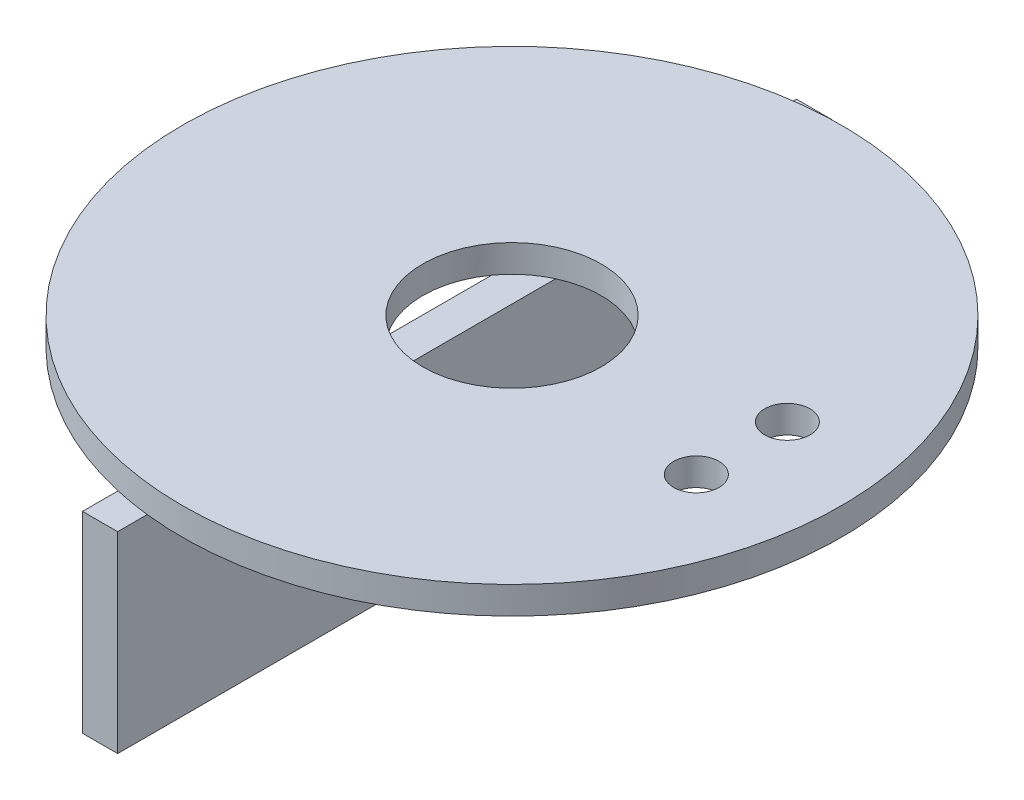
ISO-10303-21;
HEADER;
FILE_DESCRIPTION(('STEP AP214'),'2;1');
FILE_NAME('part.step','',(''),(''),'','','');
FILE_SCHEMA(('AUTOMOTIVE_DESIGN { 1 0 10303 214 1 1 1 1 }'));
ENDSEC;
DATA;
#1=APPLICATION_CONTEXT('core data for automotive mechanical design processes');
#2=APPLICATION_PROTOCOL_DEFINITION('international standard','automotive_design',2000,#1);
#3=PRODUCT_CONTEXT('',#1,'mechanical');
#4=PRODUCT('Part','Part','',(#3));
#5=PRODUCT_RELATED_PRODUCT_CATEGORY('part','',(#4));
#6=PRODUCT_DEFINITION_FORMATION('','',#4);
#7=PRODUCT_DEFINITION_CONTEXT('part definition',#1,'design');
#8=PRODUCT_DEFINITION('design','',#6,#7);
#9=PRODUCT_DEFINITION_SHAPE('','',#8);
#10=(LENGTH_UNIT() NAMED_UNIT(*) SI_UNIT(.MILLI.,.METRE.));
#11=(NAMED_UNIT(*) PLANE_ANGLE_UNIT() SI_UNIT($,.RADIAN.));
#12=(NAMED_UNIT(*) SI_UNIT($,.STERADIAN.) SOLID_ANGLE_UNIT());
#13=UNCERTAINTY_MEASURE_WITH_UNIT(LENGTH_MEASURE(1.E-05),#10,'distance_accuracy_value','');
#14=(GEOMETRIC_REPRESENTATION_CONTEXT(3) GLOBAL_UNCERTAINTY_ASSIGNED_CONTEXT((#13)) GLOBAL_UNIT_ASSIGNED_CONTEXT((#10,
#11,#12)) REPRESENTATION_CONTEXT('',''));
#15=CARTESIAN_POINT('',(0.,0.,0.));
#16=DIRECTION('',(0.,0.,1.));
#17=DIRECTION('',(1.,0.,0.));
#18=AXIS2_PLACEMENT_3D('',#15,#16,#17);
#19=CARTESIAN_POINT('',(0.,0.,0.));
#20=DIRECTION('',(0.,1.,0.));
#21=DIRECTION('',(0.,0.,1.));
#22=AXIS2_PLACEMENT_3D('',#19,#20,#21);
#23=PLANE('',#22);
#24=CARTESIAN_POINT('',(16.74,0.,3.315));
#25=DIRECTION('',(0.,-1.,0.));
#26=DIRECTION('',(0.,0.,-1.));
#27=AXIS2_PLACEMENT_3D('',#24,#25,#26);
#28=CIRCLE('',#27,1.65);
#29=CARTESIAN_POINT('',(16.74,0.,1.665));
#30=VERTEX_POINT('',#29);
#31=EDGE_CURVE('E152',#30,#30,#28,.T.);
#32=ORIENTED_EDGE('',*,*,#31,.F.);
#33=EDGE_LOOP('',(#32));
#34=FACE_BOUND('',#33,.T.);
#35=CARTESIAN_POINT('',(16.74,0.,-3.315));
#36=DIRECTION('',(0.,-1.,0.));
#37=DIRECTION('',(0.,0.,-1.));
#38=AXIS2_PLACEMENT_3D('',#35,#36,#37);
#39=CIRCLE('',#38,1.65);
#40=CARTESIAN_POINT('',(16.74,0.,-4.965));
#41=VERTEX_POINT('',#40);
#42=EDGE_CURVE('E146',#41,#41,#39,.T.);
#43=ORIENTED_EDGE('',*,*,#42,.F.);
#44=EDGE_LOOP('',(#43));
#45=FACE_BOUND('',#44,.T.);
#46=CARTESIAN_POINT('',(0.,0.,0.));
#47=DIRECTION('',(0.,1.,0.));
#48=DIRECTION('',(0.,0.,1.));
#49=AXIS2_PLACEMENT_3D('',#46,#47,#48);
#50=CIRCLE('',#49,24.);
#51=CARTESIAN_POINT('',(-2.72073101085095,0.,23.8452851265527));
#52=VERTEX_POINT('',#51);
#53=CARTESIAN_POINT('',(-2.72073101085095,0.,-23.8452851265527));
#54=VERTEX_POINT('',#53);
#55=EDGE_CURVE('E166',#52,#54,#50,.T.);
#56=ORIENTED_EDGE('',*,*,#55,.F.);
#57=DIRECTION('',(0.,0.,-1.));
#58=VECTOR('',#57,1.);
#59=CARTESIAN_POINT('',(-2.72073101085095,0.,26.));
#60=LINE('',#59,#58);
#61=CARTESIAN_POINT('',(-2.72073101085095,0.,5.90318750901529));
#62=VERTEX_POINT('',#61);
#63=EDGE_CURVE('E11',#52,#62,#60,.T.);
#64=ORIENTED_EDGE('',*,*,#63,.T.);
#65=CARTESIAN_POINT('',(0.,0.,0.));
#66=DIRECTION('',(0.,1.,0.));
#67=DIRECTION('',(0.,0.,1.));
#68=AXIS2_PLACEMENT_3D('',#65,#66,#67);
#69=CIRCLE('',#68,6.5);
#70=CARTESIAN_POINT('',(-2.72073101085095,0.,-5.90318750901526));
#71=VERTEX_POINT('',#70);
#72=EDGE_CURVE('E160',#62,#71,#69,.T.);
#73=ORIENTED_EDGE('',*,*,#72,.T.);
#74=EDGE_CURVE('E42',#71,#54,#60,.T.);
#75=ORIENTED_EDGE('',*,*,#74,.T.);
#76=EDGE_LOOP('',(#56,#64,#73,#75));
#77=FACE_BOUND('',#76,.T.);
#78=ADVANCED_FACE('F33',(#34,#45,#77),#23,.F.);
#79=CARTESIAN_POINT('',(0.,2.,0.));
#80=DIRECTION('',(0.,-1.,0.));
#81=DIRECTION('',(0.,0.,-1.));
#82=AXIS2_PLACEMENT_3D('',#79,#80,#81);
#83=CYLINDRICAL_SURFACE('',#82,24.);
#84=CARTESIAN_POINT('',(0.,2.,0.));
#85=DIRECTION('',(0.,1.,0.));
#86=DIRECTION('',(0.,0.,1.));
#87=AXIS2_PLACEMENT_3D('',#84,#85,#86);
#88=CIRCLE('',#87,24.);
#89=CARTESIAN_POINT('',(0.,2.,24.));
#90=VERTEX_POINT('',#89);
#91=EDGE_CURVE('E161',#90,#90,#88,.T.);
#92=ORIENTED_EDGE('',*,*,#91,.F.);
#93=EDGE_LOOP('',(#92));
#94=FACE_BOUND('',#93,.T.);
#95=CARTESIAN_POINT('',(-5.27926898914905,0.,-23.4121617741764));
#96=VERTEX_POINT('',#95);
#97=EDGE_CURVE('E163',#54,#96,#50,.T.);
#98=ORIENTED_EDGE('',*,*,#97,.T.);
#99=CARTESIAN_POINT('',(-5.27926898914905,0.,23.4121617741765));
#100=VERTEX_POINT('',#99);
#101=EDGE_CURVE('E165',#96,#100,#50,.T.);
#102=ORIENTED_EDGE('',*,*,#101,.T.);
#103=EDGE_CURVE('E170',#100,#52,#50,.T.);
#104=ORIENTED_EDGE('',*,*,#103,.T.);
#105=ORIENTED_EDGE('',*,*,#55,.T.);
#106=EDGE_LOOP('',(#98,#102,#104,#105));
#107=FACE_BOUND('',#106,.T.);
#108=ADVANCED_FACE('F35',(#94,#107),#83,.T.);
#109=CARTESIAN_POINT('',(0.,2.,0.));
#110=DIRECTION('',(0.,1.,0.));
#111=DIRECTION('',(0.,0.,1.));
#112=AXIS2_PLACEMENT_3D('',#109,#110,#111);
#113=PLANE('',#112);
#114=CARTESIAN_POINT('',(16.74,2.,-3.315));
#115=DIRECTION('',(0.,-1.,0.));
#116=DIRECTION('',(0.,0.,-1.));
#117=AXIS2_PLACEMENT_3D('',#114,#115,#116);
#118=CIRCLE('',#117,1.65);
#119=CARTESIAN_POINT('',(16.74,2.,-4.965));
#120=VERTEX_POINT('',#119);
#121=EDGE_CURVE('E142',#120,#120,#118,.T.);
#122=ORIENTED_EDGE('',*,*,#121,.T.);
#123=EDGE_LOOP('',(#122));
#124=FACE_BOUND('',#123,.T.);
#125=CARTESIAN_POINT('',(16.74,2.,3.315));
#126=DIRECTION('',(0.,-1.,0.));
#127=DIRECTION('',(0.,0.,-1.));
#128=AXIS2_PLACEMENT_3D('',#125,#126,#127);
#129=CIRCLE('',#128,1.65);
#130=CARTESIAN_POINT('',(16.74,2.,1.665));
#131=VERTEX_POINT('',#130);
#132=EDGE_CURVE('E149',#131,#131,#129,.T.);
#133=ORIENTED_EDGE('',*,*,#132,.T.);
#134=EDGE_LOOP('',(#133));
#135=FACE_BOUND('',#134,.T.);
#136=CARTESIAN_POINT('',(0.,2.,0.));
#137=DIRECTION('',(0.,1.,0.));
#138=DIRECTION('',(0.,0.,1.));
#139=AXIS2_PLACEMENT_3D('',#136,#137,#138);
#140=CIRCLE('',#139,6.5);
#141=CARTESIAN_POINT('',(0.,2.,6.5));
#142=VERTEX_POINT('',#141);
#143=EDGE_CURVE('E155',#142,#142,#140,.T.);
#144=ORIENTED_EDGE('',*,*,#143,.F.);
#145=EDGE_LOOP('',(#144));
#146=FACE_BOUND('',#145,.T.);
#147=ORIENTED_EDGE('',*,*,#91,.T.);
#148=EDGE_LOOP('',(#147));
#149=FACE_BOUND('',#148,.T.);
#150=ADVANCED_FACE('F218',(#124,#135,#146,#149),#113,.T.);
#151=ORIENTED_EDGE('',*,*,#101,.F.);
#152=DIRECTION('',(0.,0.,1.));
#153=VECTOR('',#152,1.);
#154=CARTESIAN_POINT('',(-5.27926898914905,0.,26.));
#155=LINE('',#154,#153);
#156=CARTESIAN_POINT('',(-5.27926898914905,0.,-3.79200724421897));
#157=VERTEX_POINT('',#156);
#158=EDGE_CURVE('E194',#96,#157,#155,.T.);
#159=ORIENTED_EDGE('',*,*,#158,.T.);
#160=CARTESIAN_POINT('',(-5.27926898914905,0.,3.79200724421898));
#161=VERTEX_POINT('',#160);
#162=EDGE_CURVE('E173',#157,#161,#69,.T.);
#163=ORIENTED_EDGE('',*,*,#162,.T.);
#164=EDGE_CURVE('E139',#161,#100,#155,.T.);
#165=ORIENTED_EDGE('',*,*,#164,.T.);
#166=EDGE_LOOP('',(#151,#159,#163,#165));
#167=FACE_BOUND('',#166,.T.);
#168=ADVANCED_FACE('F193',(#167),#23,.F.);
#169=CARTESIAN_POINT('',(0.,-0.4,0.));
#170=DIRECTION('',(0.,1.,0.));
#171=DIRECTION('',(0.,0.,1.));
#172=AXIS2_PLACEMENT_3D('',#169,#170,#171);
#173=CYLINDRICAL_SURFACE('',#172,6.5);
#174=ORIENTED_EDGE('',*,*,#143,.T.);
#175=EDGE_LOOP('',(#174));
#176=FACE_BOUND('',#175,.T.);
#177=EDGE_CURVE('E37',#71,#157,#69,.T.);
#178=ORIENTED_EDGE('',*,*,#177,.F.);
#179=ORIENTED_EDGE('',*,*,#72,.F.);
#180=EDGE_CURVE('E179',#161,#62,#69,.T.);
#181=ORIENTED_EDGE('',*,*,#180,.F.);
#182=ORIENTED_EDGE('',*,*,#162,.F.);
#183=EDGE_LOOP('',(#178,#179,#181,#182));
#184=FACE_BOUND('',#183,.T.);
#185=ADVANCED_FACE('F189',(#176,#184),#173,.F.);
#186=CARTESIAN_POINT('',(16.74,0.,3.315));
#187=DIRECTION('',(0.,1.,0.));
#188=DIRECTION('',(0.,0.,1.));
#189=AXIS2_PLACEMENT_3D('',#186,#187,#188);
#190=CYLINDRICAL_SURFACE('',#189,1.65);
#191=ORIENTED_EDGE('',*,*,#31,.T.);
#192=EDGE_LOOP('',(#191));
#193=FACE_BOUND('',#192,.T.);
#194=ORIENTED_EDGE('',*,*,#132,.F.);
#195=EDGE_LOOP('',(#194));
#196=FACE_BOUND('',#195,.T.);
#197=ADVANCED_FACE('F227',(#193,#196),#190,.F.);
#198=CARTESIAN_POINT('',(16.74,0.,-3.315));
#199=DIRECTION('',(0.,1.,0.));
#200=DIRECTION('',(0.,0.,1.));
#201=AXIS2_PLACEMENT_3D('',#198,#199,#200);
#202=CYLINDRICAL_SURFACE('',#201,1.65);
#203=ORIENTED_EDGE('',*,*,#42,.T.);
#204=EDGE_LOOP('',(#203));
#205=FACE_BOUND('',#204,.T.);
#206=ORIENTED_EDGE('',*,*,#121,.F.);
#207=EDGE_LOOP('',(#206));
#208=FACE_BOUND('',#207,.T.);
#209=ADVANCED_FACE('F239',(#205,#208),#202,.F.);
#210=CARTESIAN_POINT('',(0.,0.,0.));
#211=DIRECTION('',(0.,-1.,0.));
#212=DIRECTION('',(0.,0.,-1.));
#213=AXIS2_PLACEMENT_3D('',#210,#211,#212);
#214=PLANE('',#213);
#215=EDGE_CURVE('E44',#62,#71,#60,.T.);
#216=ORIENTED_EDGE('',*,*,#215,.T.);
#217=ORIENTED_EDGE('',*,*,#177,.T.);
#218=EDGE_CURVE('E57',#157,#161,#155,.T.);
#219=ORIENTED_EDGE('',*,*,#218,.T.);
#220=ORIENTED_EDGE('',*,*,#180,.T.);
#221=EDGE_LOOP('',(#216,#217,#219,#220));
#222=FACE_BOUND('',#221,.T.);
#223=ADVANCED_FACE('F186',(#222),#214,.F.);
#224=ORIENTED_EDGE('',*,*,#97,.F.);
#225=CARTESIAN_POINT('',(-2.72073101085095,0.,-26.));
#226=VERTEX_POINT('',#225);
#227=EDGE_CURVE('E136',#54,#226,#60,.T.);
#228=ORIENTED_EDGE('',*,*,#227,.T.);
#229=DIRECTION('',(-1.,0.,0.));
#230=VECTOR('',#229,1.);
#231=CARTESIAN_POINT('',(-5.27926898914905,0.,-26.));
#232=LINE('',#231,#230);
#233=CARTESIAN_POINT('',(-5.27926898914905,0.,-26.));
#234=VERTEX_POINT('',#233);
#235=EDGE_CURVE('E106',#226,#234,#232,.T.);
#236=ORIENTED_EDGE('',*,*,#235,.T.);
#237=EDGE_CURVE('E129',#234,#96,#155,.T.);
#238=ORIENTED_EDGE('',*,*,#237,.T.);
#239=EDGE_LOOP('',(#224,#228,#236,#238));
#240=FACE_BOUND('',#239,.T.);
#241=ADVANCED_FACE('F209',(#240),#214,.F.);
#242=CARTESIAN_POINT('',(-2.72073101085095,-14.,26.));
#243=DIRECTION('',(1.,0.,0.));
#244=DIRECTION('',(0.,0.,-1.));
#245=AXIS2_PLACEMENT_3D('',#242,#243,#244);
#246=PLANE('',#245);
#247=CARTESIAN_POINT('',(-2.72073101085095,0.,26.));
#248=VERTEX_POINT('',#247);
#249=EDGE_CURVE('E133',#248,#52,#60,.T.);
#250=ORIENTED_EDGE('',*,*,#249,.F.);
#251=DIRECTION('',(0.,1.,0.));
#252=VECTOR('',#251,1.);
#253=CARTESIAN_POINT('',(-2.72073101085095,-14.,26.));
#254=LINE('',#253,#252);
#255=CARTESIAN_POINT('',(-2.72073101085095,-14.,26.));
#256=VERTEX_POINT('',#255);
#257=EDGE_CURVE('E125',#256,#248,#254,.T.);
#258=ORIENTED_EDGE('',*,*,#257,.F.);
#259=DIRECTION('',(0.,0.,-1.));
#260=VECTOR('',#259,1.);
#261=CARTESIAN_POINT('',(-2.72073101085095,-14.,26.));
#262=LINE('',#261,#260);
#263=CARTESIAN_POINT('',(-2.72073101085095,-14.,-26.));
#264=VERTEX_POINT('',#263);
#265=EDGE_CURVE('E118',#256,#264,#262,.T.);
#266=ORIENTED_EDGE('',*,*,#265,.T.);
#267=DIRECTION('',(0.,1.,0.));
#268=VECTOR('',#267,1.);
#269=CARTESIAN_POINT('',(-2.72073101085095,-14.,-26.));
#270=LINE('',#269,#268);
#271=EDGE_CURVE('E101',#264,#226,#270,.T.);
#272=ORIENTED_EDGE('',*,*,#271,.T.);
#273=ORIENTED_EDGE('',*,*,#227,.F.);
#274=ORIENTED_EDGE('',*,*,#74,.F.);
#275=ORIENTED_EDGE('',*,*,#215,.F.);
#276=ORIENTED_EDGE('',*,*,#63,.F.);
#277=EDGE_LOOP('',(#250,#258,#266,#272,#273,#274,#275,#276));
#278=FACE_BOUND('',#277,.T.);
#279=ADVANCED_FACE('F124',(#278),#246,.T.);
#280=CARTESIAN_POINT('',(-5.27926898914905,-14.,26.));
#281=DIRECTION('',(0.,0.,1.));
#282=DIRECTION('',(1.,0.,0.));
#283=AXIS2_PLACEMENT_3D('',#280,#281,#282);
#284=PLANE('',#283);
#285=DIRECTION('',(1.,0.,0.));
#286=VECTOR('',#285,1.);
#287=CARTESIAN_POINT('',(-5.27926898914905,0.,26.));
#288=LINE('',#287,#286);
#289=CARTESIAN_POINT('',(-5.27926898914905,0.,26.));
#290=VERTEX_POINT('',#289);
#291=EDGE_CURVE('E126',#290,#248,#288,.T.);
#292=ORIENTED_EDGE('',*,*,#291,.F.);
#293=DIRECTION('',(0.,1.,0.));
#294=VECTOR('',#293,1.);
#295=CARTESIAN_POINT('',(-5.27926898914905,-14.,26.));
#296=LINE('',#295,#294);
#297=CARTESIAN_POINT('',(-5.27926898914905,-14.,26.));
#298=VERTEX_POINT('',#297);
#299=EDGE_CURVE('E143',#298,#290,#296,.T.);
#300=ORIENTED_EDGE('',*,*,#299,.F.);
#301=DIRECTION('',(1.,0.,0.));
#302=VECTOR('',#301,1.);
#303=CARTESIAN_POINT('',(-5.27926898914905,-14.,26.));
#304=LINE('',#303,#302);
#305=EDGE_CURVE('E111',#298,#256,#304,.T.);
#306=ORIENTED_EDGE('',*,*,#305,.T.);
#307=ORIENTED_EDGE('',*,*,#257,.T.);
#308=EDGE_LOOP('',(#292,#300,#306,#307));
#309=FACE_BOUND('',#308,.T.);
#310=ADVANCED_FACE('F201',(#309),#284,.T.);
#311=CARTESIAN_POINT('',(-5.27926898914905,-14.,26.));
#312=DIRECTION('',(-1.,0.,0.));
#313=DIRECTION('',(0.,0.,1.));
#314=AXIS2_PLACEMENT_3D('',#311,#312,#313);
#315=PLANE('',#314);
#316=ORIENTED_EDGE('',*,*,#237,.F.);
#317=DIRECTION('',(0.,1.,0.));
#318=VECTOR('',#317,1.);
#319=CARTESIAN_POINT('',(-5.27926898914905,-14.,-26.));
#320=LINE('',#319,#318);
#321=CARTESIAN_POINT('',(-5.27926898914905,-14.,-26.));
#322=VERTEX_POINT('',#321);
#323=EDGE_CURVE('E110',#322,#234,#320,.T.);
#324=ORIENTED_EDGE('',*,*,#323,.F.);
#325=DIRECTION('',(0.,0.,1.));
#326=VECTOR('',#325,1.);
#327=CARTESIAN_POINT('',(-5.27926898914905,-14.,26.));
#328=LINE('',#327,#326);
#329=EDGE_CURVE('E121',#322,#298,#328,.T.);
#330=ORIENTED_EDGE('',*,*,#329,.T.);
#331=ORIENTED_EDGE('',*,*,#299,.T.);
#332=EDGE_CURVE('E51',#100,#290,#155,.T.);
#333=ORIENTED_EDGE('',*,*,#332,.F.);
#334=ORIENTED_EDGE('',*,*,#164,.F.);
#335=ORIENTED_EDGE('',*,*,#218,.F.);
#336=ORIENTED_EDGE('',*,*,#158,.F.);
#337=EDGE_LOOP('',(#316,#324,#330,#331,#333,#334,#335,#336));
#338=FACE_BOUND('',#337,.T.);
#339=ADVANCED_FACE('F199',(#338),#315,.T.);
#340=CARTESIAN_POINT('',(-5.27926898914905,-14.,-26.));
#341=DIRECTION('',(0.,0.,-1.));
#342=DIRECTION('',(-1.,0.,0.));
#343=AXIS2_PLACEMENT_3D('',#340,#341,#342);
#344=PLANE('',#343);
#345=ORIENTED_EDGE('',*,*,#235,.F.);
#346=ORIENTED_EDGE('',*,*,#271,.F.);
#347=DIRECTION('',(-1.,0.,0.));
#348=VECTOR('',#347,1.);
#349=CARTESIAN_POINT('',(-5.27926898914905,-14.,-26.));
#350=LINE('',#349,#348);
#351=EDGE_CURVE('E104',#264,#322,#350,.T.);
#352=ORIENTED_EDGE('',*,*,#351,.T.);
#353=ORIENTED_EDGE('',*,*,#323,.T.);
#354=EDGE_LOOP('',(#345,#346,#352,#353));
#355=FACE_BOUND('',#354,.T.);
#356=ADVANCED_FACE('F103',(#355),#344,.T.);
#357=CARTESIAN_POINT('',(0.,-14.,0.));
#358=DIRECTION('',(0.,-1.,0.));
#359=DIRECTION('',(0.,0.,-1.));
#360=AXIS2_PLACEMENT_3D('',#357,#358,#359);
#361=PLANE('',#360);
#362=ORIENTED_EDGE('',*,*,#265,.F.);
#363=ORIENTED_EDGE('',*,*,#305,.F.);
#364=ORIENTED_EDGE('',*,*,#329,.F.);
#365=ORIENTED_EDGE('',*,*,#351,.F.);
#366=EDGE_LOOP('',(#362,#363,#364,#365));
#367=FACE_BOUND('',#366,.T.);
#368=ADVANCED_FACE('F116',(#367),#361,.T.);
#369=ORIENTED_EDGE('',*,*,#103,.F.);
#370=ORIENTED_EDGE('',*,*,#332,.T.);
#371=ORIENTED_EDGE('',*,*,#291,.T.);
#372=ORIENTED_EDGE('',*,*,#249,.T.);
#373=EDGE_LOOP('',(#369,#370,#371,#372));
#374=FACE_BOUND('',#373,.T.);
#375=ADVANCED_FACE('F197',(#374),#214,.F.);
#376=CLOSED_SHELL('',(#78,#108,#150,#168,#185,#197,#209,#223,#241,#279,#310,#339,#356,#368,#375));
#377=MANIFOLD_SOLID_BREP('B2',#376);
#378=ADVANCED_BREP_SHAPE_REPRESENTATION('',(#18,#377),#14);
#379=SHAPE_DEFINITION_REPRESENTATION(#9,#378);
ENDSEC;
END-ISO-10303-21;
